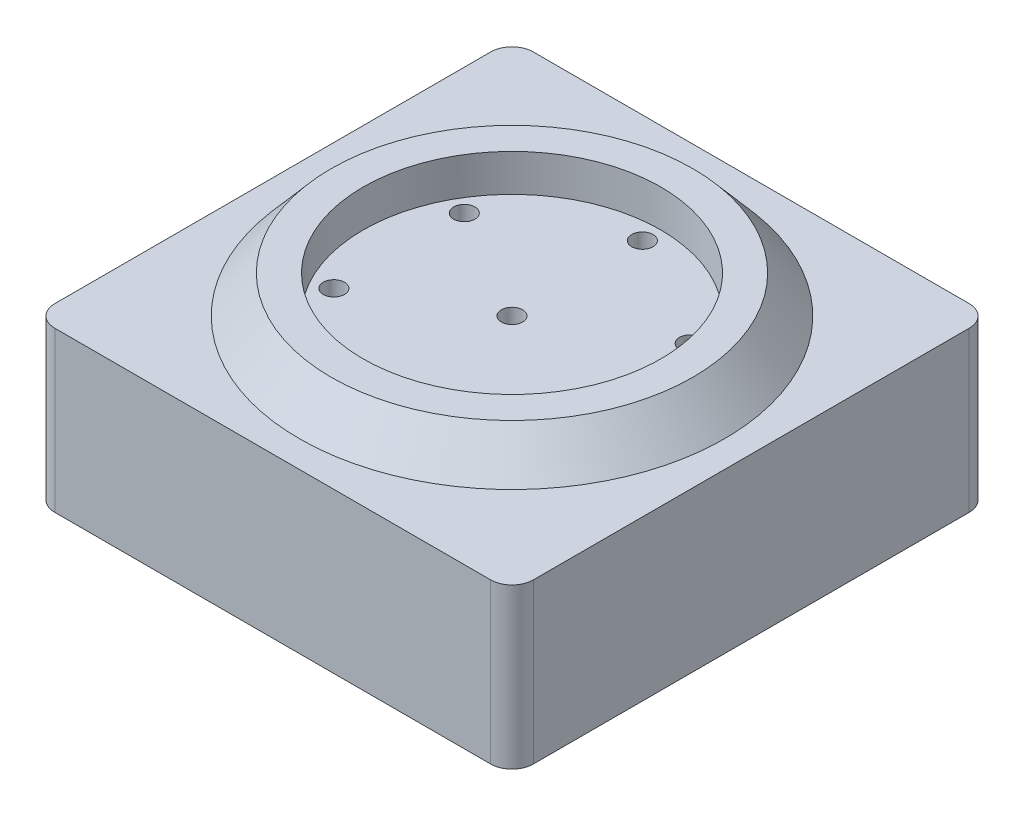
ISO-10303-21;
HEADER;
FILE_DESCRIPTION(('STEP AP214'),'2;1');
FILE_NAME('part.step','',(''),(''),'','','');
FILE_SCHEMA(('AUTOMOTIVE_DESIGN { 1 0 10303 214 1 1 1 1 }'));
ENDSEC;
DATA;
#1=APPLICATION_CONTEXT('core data for automotive mechanical design processes');
#2=APPLICATION_PROTOCOL_DEFINITION('international standard','automotive_design',2000,#1);
#3=PRODUCT_CONTEXT('',#1,'mechanical');
#4=PRODUCT('Part','Part','',(#3));
#5=PRODUCT_RELATED_PRODUCT_CATEGORY('part','',(#4));
#6=PRODUCT_DEFINITION_FORMATION('','',#4);
#7=PRODUCT_DEFINITION_CONTEXT('part definition',#1,'design');
#8=PRODUCT_DEFINITION('design','',#6,#7);
#9=PRODUCT_DEFINITION_SHAPE('','',#8);
#10=(LENGTH_UNIT() NAMED_UNIT(*) SI_UNIT(.MILLI.,.METRE.));
#11=(NAMED_UNIT(*) PLANE_ANGLE_UNIT() SI_UNIT($,.RADIAN.));
#12=(NAMED_UNIT(*) SI_UNIT($,.STERADIAN.) SOLID_ANGLE_UNIT());
#13=UNCERTAINTY_MEASURE_WITH_UNIT(LENGTH_MEASURE(1.E-05),#10,'distance_accuracy_value','');
#14=(GEOMETRIC_REPRESENTATION_CONTEXT(3) GLOBAL_UNCERTAINTY_ASSIGNED_CONTEXT((#13)) GLOBAL_UNIT_ASSIGNED_CONTEXT((#10,
#11,#12)) REPRESENTATION_CONTEXT('',''));
#15=CARTESIAN_POINT('',(0.,0.,0.));
#16=DIRECTION('',(0.,0.,1.));
#17=DIRECTION('',(1.,0.,0.));
#18=AXIS2_PLACEMENT_3D('',#15,#16,#17);
#19=CARTESIAN_POINT('',(-3.5527136788005E-12,-3.33066907387547E-12,0.));
#20=DIRECTION('',(0.,1.,0.));
#21=DIRECTION('',(-1.,0.,0.));
#22=AXIS2_PLACEMENT_3D('',#19,#20,#21);
#23=CYLINDRICAL_SURFACE('',#22,1400.);
#24=CARTESIAN_POINT('',(-8.88178419700125E-13,1850.,0.));
#25=DIRECTION('',(0.,1.,0.));
#26=DIRECTION('',(-1.,0.,0.));
#27=AXIS2_PLACEMENT_3D('',#24,#25,#26);
#28=CIRCLE('',#27,1400.);
#29=CARTESIAN_POINT('',(-1400.,1850.,0.));
#30=VERTEX_POINT('',#29);
#31=EDGE_CURVE('E227',#30,#30,#28,.T.);
#32=ORIENTED_EDGE('',*,*,#31,.T.);
#33=EDGE_LOOP('',(#32));
#34=FACE_BOUND('',#33,.T.);
#35=CARTESIAN_POINT('',(-1.33226762955019E-12,1500.,0.));
#36=DIRECTION('',(0.,-1.,0.));
#37=DIRECTION('',(0.,0.,-1.));
#38=AXIS2_PLACEMENT_3D('',#35,#36,#37);
#39=CIRCLE('',#38,1400.);
#40=CARTESIAN_POINT('',(-1.33226762955019E-12,1500.,-1400.));
#41=VERTEX_POINT('',#40);
#42=EDGE_CURVE('E13',#41,#41,#39,.F.);
#43=ORIENTED_EDGE('',*,*,#42,.F.);
#44=EDGE_LOOP('',(#43));
#45=FACE_BOUND('',#44,.T.);
#46=ADVANCED_FACE('F55',(#34,#45),#23,.F.);
#47=CARTESIAN_POINT('',(2050.,1500.,-2050.));
#48=DIRECTION('',(0.,-1.,0.));
#49=DIRECTION('',(0.,0.,-1.));
#50=AXIS2_PLACEMENT_3D('',#47,#48,#49);
#51=CYLINDRICAL_SURFACE('',#50,200.);
#52=CARTESIAN_POINT('',(2050.,0.,-2050.));
#53=DIRECTION('',(0.,1.,0.));
#54=DIRECTION('',(0.,0.,-1.));
#55=AXIS2_PLACEMENT_3D('',#52,#53,#54);
#56=CIRCLE('',#55,200.);
#57=CARTESIAN_POINT('',(2250.,0.,-2050.));
#58=VERTEX_POINT('',#57);
#59=CARTESIAN_POINT('',(2050.,0.,-2250.));
#60=VERTEX_POINT('',#59);
#61=EDGE_CURVE('E172',#58,#60,#56,.T.);
#62=ORIENTED_EDGE('',*,*,#61,.T.);
#63=DIRECTION('',(0.,-1.,0.));
#64=VECTOR('',#63,1.);
#65=CARTESIAN_POINT('',(2050.,1500.,-2250.));
#66=LINE('',#65,#64);
#67=CARTESIAN_POINT('',(2050.,1500.,-2250.));
#68=VERTEX_POINT('',#67);
#69=EDGE_CURVE('E215',#68,#60,#66,.T.);
#70=ORIENTED_EDGE('',*,*,#69,.F.);
#71=CARTESIAN_POINT('',(2050.,1500.,-2050.));
#72=DIRECTION('',(0.,1.,0.));
#73=DIRECTION('',(0.,0.,-1.));
#74=AXIS2_PLACEMENT_3D('',#71,#72,#73);
#75=CIRCLE('',#74,200.);
#76=CARTESIAN_POINT('',(2250.,1500.,-2050.));
#77=VERTEX_POINT('',#76);
#78=EDGE_CURVE('E196',#77,#68,#75,.T.);
#79=ORIENTED_EDGE('',*,*,#78,.F.);
#80=DIRECTION('',(0.,-1.,0.));
#81=VECTOR('',#80,1.);
#82=CARTESIAN_POINT('',(2250.,1500.,-2050.));
#83=LINE('',#82,#81);
#84=EDGE_CURVE('E168',#77,#58,#83,.T.);
#85=ORIENTED_EDGE('',*,*,#84,.T.);
#86=EDGE_LOOP('',(#62,#70,#79,#85));
#87=FACE_BOUND('',#86,.T.);
#88=ADVANCED_FACE('F57',(#87),#51,.T.);
#89=CARTESIAN_POINT('',(-2050.,1500.,-2250.));
#90=DIRECTION('',(0.,0.,1.));
#91=DIRECTION('',(1.,0.,0.));
#92=AXIS2_PLACEMENT_3D('',#89,#90,#91);
#93=PLANE('',#92);
#94=DIRECTION('',(-1.,0.,0.));
#95=VECTOR('',#94,1.);
#96=CARTESIAN_POINT('',(-2050.,0.,-2250.));
#97=LINE('',#96,#95);
#98=CARTESIAN_POINT('',(-2050.,0.,-2250.));
#99=VERTEX_POINT('',#98);
#100=EDGE_CURVE('E176',#60,#99,#97,.T.);
#101=ORIENTED_EDGE('',*,*,#100,.T.);
#102=DIRECTION('',(0.,-1.,0.));
#103=VECTOR('',#102,1.);
#104=CARTESIAN_POINT('',(-2050.,1500.,-2250.));
#105=LINE('',#104,#103);
#106=CARTESIAN_POINT('',(-2050.,1500.,-2250.));
#107=VERTEX_POINT('',#106);
#108=EDGE_CURVE('E211',#107,#99,#105,.T.);
#109=ORIENTED_EDGE('',*,*,#108,.F.);
#110=DIRECTION('',(-1.,0.,0.));
#111=VECTOR('',#110,1.);
#112=CARTESIAN_POINT('',(-2050.,1500.,-2250.));
#113=LINE('',#112,#111);
#114=EDGE_CURVE('E123',#68,#107,#113,.T.);
#115=ORIENTED_EDGE('',*,*,#114,.F.);
#116=ORIENTED_EDGE('',*,*,#69,.T.);
#117=EDGE_LOOP('',(#101,#109,#115,#116));
#118=FACE_BOUND('',#117,.T.);
#119=ADVANCED_FACE('F467',(#118),#93,.F.);
#120=CARTESIAN_POINT('',(-2050.,1500.,-2050.));
#121=DIRECTION('',(0.,-1.,0.));
#122=DIRECTION('',(0.,0.,-1.));
#123=AXIS2_PLACEMENT_3D('',#120,#121,#122);
#124=CYLINDRICAL_SURFACE('',#123,200.);
#125=CARTESIAN_POINT('',(-2050.,0.,-2050.));
#126=DIRECTION('',(0.,1.,0.));
#127=DIRECTION('',(0.,0.,1.));
#128=AXIS2_PLACEMENT_3D('',#125,#126,#127);
#129=CIRCLE('',#128,200.);
#130=CARTESIAN_POINT('',(-2250.,0.,-2050.));
#131=VERTEX_POINT('',#130);
#132=EDGE_CURVE('E180',#99,#131,#129,.T.);
#133=ORIENTED_EDGE('',*,*,#132,.T.);
#134=DIRECTION('',(0.,-1.,0.));
#135=VECTOR('',#134,1.);
#136=CARTESIAN_POINT('',(-2250.,1500.,-2050.));
#137=LINE('',#136,#135);
#138=CARTESIAN_POINT('',(-2250.,1500.,-2050.));
#139=VERTEX_POINT('',#138);
#140=EDGE_CURVE('E207',#139,#131,#137,.T.);
#141=ORIENTED_EDGE('',*,*,#140,.F.);
#142=CARTESIAN_POINT('',(-2050.,1500.,-2050.));
#143=DIRECTION('',(0.,1.,0.));
#144=DIRECTION('',(0.,0.,1.));
#145=AXIS2_PLACEMENT_3D('',#142,#143,#144);
#146=CIRCLE('',#145,200.);
#147=EDGE_CURVE('E236',#107,#139,#146,.T.);
#148=ORIENTED_EDGE('',*,*,#147,.F.);
#149=ORIENTED_EDGE('',*,*,#108,.T.);
#150=EDGE_LOOP('',(#133,#141,#148,#149));
#151=FACE_BOUND('',#150,.T.);
#152=ADVANCED_FACE('F746',(#151),#124,.T.);
#153=CARTESIAN_POINT('',(-2250.,1500.,-2050.));
#154=DIRECTION('',(1.,0.,0.));
#155=DIRECTION('',(0.,0.,-1.));
#156=AXIS2_PLACEMENT_3D('',#153,#154,#155);
#157=PLANE('',#156);
#158=DIRECTION('',(0.,0.,1.));
#159=VECTOR('',#158,1.);
#160=CARTESIAN_POINT('',(-2250.,0.,-2050.));
#161=LINE('',#160,#159);
#162=CARTESIAN_POINT('',(-2250.,0.,2050.));
#163=VERTEX_POINT('',#162);
#164=EDGE_CURVE('E183',#131,#163,#161,.T.);
#165=ORIENTED_EDGE('',*,*,#164,.T.);
#166=DIRECTION('',(0.,-1.,0.));
#167=VECTOR('',#166,1.);
#168=CARTESIAN_POINT('',(-2250.,1500.,2050.));
#169=LINE('',#168,#167);
#170=CARTESIAN_POINT('',(-2250.,1500.,2050.));
#171=VERTEX_POINT('',#170);
#172=EDGE_CURVE('E203',#171,#163,#169,.T.);
#173=ORIENTED_EDGE('',*,*,#172,.F.);
#174=DIRECTION('',(0.,0.,1.));
#175=VECTOR('',#174,1.);
#176=CARTESIAN_POINT('',(-2250.,1500.,-2050.));
#177=LINE('',#176,#175);
#178=EDGE_CURVE('E239',#139,#171,#177,.T.);
#179=ORIENTED_EDGE('',*,*,#178,.F.);
#180=ORIENTED_EDGE('',*,*,#140,.T.);
#181=EDGE_LOOP('',(#165,#173,#179,#180));
#182=FACE_BOUND('',#181,.T.);
#183=ADVANCED_FACE('F738',(#182),#157,.F.);
#184=CARTESIAN_POINT('',(-2050.,1500.,2050.));
#185=DIRECTION('',(0.,-1.,0.));
#186=DIRECTION('',(0.,0.,-1.));
#187=AXIS2_PLACEMENT_3D('',#184,#185,#186);
#188=CYLINDRICAL_SURFACE('',#187,200.);
#189=CARTESIAN_POINT('',(-2050.,0.,2050.));
#190=DIRECTION('',(0.,1.,0.));
#191=DIRECTION('',(0.,0.,1.));
#192=AXIS2_PLACEMENT_3D('',#189,#190,#191);
#193=CIRCLE('',#192,200.);
#194=CARTESIAN_POINT('',(-2050.,0.,2250.));
#195=VERTEX_POINT('',#194);
#196=EDGE_CURVE('E186',#163,#195,#193,.T.);
#197=ORIENTED_EDGE('',*,*,#196,.T.);
#198=DIRECTION('',(0.,-1.,0.));
#199=VECTOR('',#198,1.);
#200=CARTESIAN_POINT('',(-2050.,1500.,2250.));
#201=LINE('',#200,#199);
#202=CARTESIAN_POINT('',(-2050.,1500.,2250.));
#203=VERTEX_POINT('',#202);
#204=EDGE_CURVE('E160',#203,#195,#201,.T.);
#205=ORIENTED_EDGE('',*,*,#204,.F.);
#206=CARTESIAN_POINT('',(-2050.,1500.,2050.));
#207=DIRECTION('',(0.,1.,0.));
#208=DIRECTION('',(0.,0.,1.));
#209=AXIS2_PLACEMENT_3D('',#206,#207,#208);
#210=CIRCLE('',#209,200.);
#211=EDGE_CURVE('E146',#171,#203,#210,.T.);
#212=ORIENTED_EDGE('',*,*,#211,.F.);
#213=ORIENTED_EDGE('',*,*,#172,.T.);
#214=EDGE_LOOP('',(#197,#205,#212,#213));
#215=FACE_BOUND('',#214,.T.);
#216=ADVANCED_FACE('F731',(#215),#188,.T.);
#217=CARTESIAN_POINT('',(-2050.,1500.,2250.));
#218=DIRECTION('',(0.,0.,-1.));
#219=DIRECTION('',(-1.,0.,0.));
#220=AXIS2_PLACEMENT_3D('',#217,#218,#219);
#221=PLANE('',#220);
#222=DIRECTION('',(1.,0.,0.));
#223=VECTOR('',#222,1.);
#224=CARTESIAN_POINT('',(-2050.,0.,2250.));
#225=LINE('',#224,#223);
#226=CARTESIAN_POINT('',(2050.,0.,2250.));
#227=VERTEX_POINT('',#226);
#228=EDGE_CURVE('E156',#195,#227,#225,.T.);
#229=ORIENTED_EDGE('',*,*,#228,.T.);
#230=DIRECTION('',(0.,-1.,0.));
#231=VECTOR('',#230,1.);
#232=CARTESIAN_POINT('',(2050.,1500.,2250.));
#233=LINE('',#232,#231);
#234=CARTESIAN_POINT('',(2050.,1500.,2250.));
#235=VERTEX_POINT('',#234);
#236=EDGE_CURVE('E153',#235,#227,#233,.T.);
#237=ORIENTED_EDGE('',*,*,#236,.F.);
#238=DIRECTION('',(1.,0.,0.));
#239=VECTOR('',#238,1.);
#240=CARTESIAN_POINT('',(-2050.,1500.,2250.));
#241=LINE('',#240,#239);
#242=EDGE_CURVE('E139',#203,#235,#241,.T.);
#243=ORIENTED_EDGE('',*,*,#242,.F.);
#244=ORIENTED_EDGE('',*,*,#204,.T.);
#245=EDGE_LOOP('',(#229,#237,#243,#244));
#246=FACE_BOUND('',#245,.T.);
#247=ADVANCED_FACE('F154',(#246),#221,.F.);
#248=CARTESIAN_POINT('',(2050.,1500.,2050.));
#249=DIRECTION('',(0.,-1.,0.));
#250=DIRECTION('',(0.,0.,-1.));
#251=AXIS2_PLACEMENT_3D('',#248,#249,#250);
#252=CYLINDRICAL_SURFACE('',#251,200.);
#253=CARTESIAN_POINT('',(2050.,0.,2050.));
#254=DIRECTION('',(0.,1.,0.));
#255=DIRECTION('',(0.,0.,1.));
#256=AXIS2_PLACEMENT_3D('',#253,#254,#255);
#257=CIRCLE('',#256,200.);
#258=CARTESIAN_POINT('',(2250.,0.,2050.));
#259=VERTEX_POINT('',#258);
#260=EDGE_CURVE('E191',#227,#259,#257,.T.);
#261=ORIENTED_EDGE('',*,*,#260,.T.);
#262=DIRECTION('',(0.,-1.,0.));
#263=VECTOR('',#262,1.);
#264=CARTESIAN_POINT('',(2250.,1500.,2050.));
#265=LINE('',#264,#263);
#266=CARTESIAN_POINT('',(2250.,1500.,2050.));
#267=VERTEX_POINT('',#266);
#268=EDGE_CURVE('E161',#267,#259,#265,.T.);
#269=ORIENTED_EDGE('',*,*,#268,.F.);
#270=CARTESIAN_POINT('',(2050.,1500.,2050.));
#271=DIRECTION('',(0.,1.,0.));
#272=DIRECTION('',(0.,0.,1.));
#273=AXIS2_PLACEMENT_3D('',#270,#271,#272);
#274=CIRCLE('',#273,200.);
#275=EDGE_CURVE('E143',#235,#267,#274,.T.);
#276=ORIENTED_EDGE('',*,*,#275,.F.);
#277=ORIENTED_EDGE('',*,*,#236,.T.);
#278=EDGE_LOOP('',(#261,#269,#276,#277));
#279=FACE_BOUND('',#278,.T.);
#280=ADVANCED_FACE('F163',(#279),#252,.T.);
#281=CARTESIAN_POINT('',(2250.,1500.,-2050.));
#282=DIRECTION('',(-1.,0.,0.));
#283=DIRECTION('',(0.,0.,1.));
#284=AXIS2_PLACEMENT_3D('',#281,#282,#283);
#285=PLANE('',#284);
#286=DIRECTION('',(0.,0.,-1.));
#287=VECTOR('',#286,1.);
#288=CARTESIAN_POINT('',(2250.,0.,-2050.));
#289=LINE('',#288,#287);
#290=EDGE_CURVE('E114',#259,#58,#289,.T.);
#291=ORIENTED_EDGE('',*,*,#290,.T.);
#292=ORIENTED_EDGE('',*,*,#84,.F.);
#293=DIRECTION('',(0.,0.,-1.));
#294=VECTOR('',#293,1.);
#295=CARTESIAN_POINT('',(2250.,1500.,-2050.));
#296=LINE('',#295,#294);
#297=EDGE_CURVE('E81',#267,#77,#296,.T.);
#298=ORIENTED_EDGE('',*,*,#297,.F.);
#299=ORIENTED_EDGE('',*,*,#268,.T.);
#300=EDGE_LOOP('',(#291,#292,#298,#299));
#301=FACE_BOUND('',#300,.T.);
#302=ADVANCED_FACE('F448',(#301),#285,.F.);
#303=CARTESIAN_POINT('',(2050.,1500.,-2050.));
#304=DIRECTION('',(0.,-1.,0.));
#305=DIRECTION('',(0.,0.,-1.));
#306=AXIS2_PLACEMENT_3D('',#303,#304,#305);
#307=PLANE('',#306);
#308=CARTESIAN_POINT('',(0.,1500.,0.));
#309=DIRECTION('',(0.,1.,0.));
#310=DIRECTION('',(-1.,0.,0.));
#311=AXIS2_PLACEMENT_3D('',#308,#309,#310);
#312=CIRCLE('',#311,2000.);
#313=CARTESIAN_POINT('',(-2000.,1500.,0.));
#314=VERTEX_POINT('',#313);
#315=EDGE_CURVE('E65',#314,#314,#312,.T.);
#316=ORIENTED_EDGE('',*,*,#315,.F.);
#317=EDGE_LOOP('',(#316));
#318=FACE_BOUND('',#317,.T.);
#319=ORIENTED_EDGE('',*,*,#78,.T.);
#320=ORIENTED_EDGE('',*,*,#114,.T.);
#321=ORIENTED_EDGE('',*,*,#147,.T.);
#322=ORIENTED_EDGE('',*,*,#178,.T.);
#323=ORIENTED_EDGE('',*,*,#211,.T.);
#324=ORIENTED_EDGE('',*,*,#242,.T.);
#325=ORIENTED_EDGE('',*,*,#275,.T.);
#326=ORIENTED_EDGE('',*,*,#297,.T.);
#327=EDGE_LOOP('',(#319,#320,#321,#322,#323,#324,#325,#326));
#328=FACE_BOUND('',#327,.T.);
#329=ADVANCED_FACE('F141',(#318,#328),#307,.F.);
#330=CARTESIAN_POINT('',(2050.,0.,-2050.));
#331=DIRECTION('',(0.,-1.,0.));
#332=DIRECTION('',(0.,0.,-1.));
#333=AXIS2_PLACEMENT_3D('',#330,#331,#332);
#334=PLANE('',#333);
#335=CARTESIAN_POINT('',(-2050.,0.,-2050.));
#336=DIRECTION('',(0.,-1.,0.));
#337=DIRECTION('',(0.,0.,1.));
#338=AXIS2_PLACEMENT_3D('',#335,#336,#337);
#339=CIRCLE('',#338,100.);
#340=CARTESIAN_POINT('',(-2050.,0.,-1950.));
#341=VERTEX_POINT('',#340);
#342=EDGE_CURVE('E393',#341,#341,#339,.T.);
#343=ORIENTED_EDGE('',*,*,#342,.F.);
#344=EDGE_LOOP('',(#343));
#345=FACE_BOUND('',#344,.T.);
#346=CARTESIAN_POINT('',(2050.,0.,-2050.));
#347=DIRECTION('',(0.,-1.,0.));
#348=DIRECTION('',(0.,0.,-1.));
#349=AXIS2_PLACEMENT_3D('',#346,#347,#348);
#350=CIRCLE('',#349,100.);
#351=CARTESIAN_POINT('',(2050.,0.,-2150.));
#352=VERTEX_POINT('',#351);
#353=EDGE_CURVE('E403',#352,#352,#350,.T.);
#354=ORIENTED_EDGE('',*,*,#353,.F.);
#355=EDGE_LOOP('',(#354));
#356=FACE_BOUND('',#355,.T.);
#357=CARTESIAN_POINT('',(2050.,0.,2050.));
#358=DIRECTION('',(0.,-1.,0.));
#359=DIRECTION('',(0.,0.,1.));
#360=AXIS2_PLACEMENT_3D('',#357,#358,#359);
#361=CIRCLE('',#360,100.);
#362=CARTESIAN_POINT('',(2050.,0.,2150.));
#363=VERTEX_POINT('',#362);
#364=EDGE_CURVE('E413',#363,#363,#361,.T.);
#365=ORIENTED_EDGE('',*,*,#364,.F.);
#366=EDGE_LOOP('',(#365));
#367=FACE_BOUND('',#366,.T.);
#368=CARTESIAN_POINT('',(-2050.,0.,2050.));
#369=DIRECTION('',(0.,-1.,0.));
#370=DIRECTION('',(0.,0.,-1.));
#371=AXIS2_PLACEMENT_3D('',#368,#369,#370);
#372=CIRCLE('',#371,100.);
#373=CARTESIAN_POINT('',(-2050.,0.,1950.));
#374=VERTEX_POINT('',#373);
#375=EDGE_CURVE('E388',#374,#374,#372,.T.);
#376=ORIENTED_EDGE('',*,*,#375,.F.);
#377=EDGE_LOOP('',(#376));
#378=FACE_BOUND('',#377,.T.);
#379=DIRECTION('',(1.,0.,0.));
#380=VECTOR('',#379,1.);
#381=CARTESIAN_POINT('',(-1750.,0.,-1750.));
#382=LINE('',#381,#380);
#383=CARTESIAN_POINT('',(-1750.,0.,-1750.));
#384=VERTEX_POINT('',#383);
#385=CARTESIAN_POINT('',(1750.,0.,-1750.));
#386=VERTEX_POINT('',#385);
#387=EDGE_CURVE('E72',#384,#386,#382,.T.);
#388=ORIENTED_EDGE('',*,*,#387,.F.);
#389=DIRECTION('',(0.,0.,-1.));
#390=VECTOR('',#389,1.);
#391=CARTESIAN_POINT('',(-1750.,0.,1750.));
#392=LINE('',#391,#390);
#393=CARTESIAN_POINT('',(-1750.,0.,1750.));
#394=VERTEX_POINT('',#393);
#395=EDGE_CURVE('E365',#394,#384,#392,.T.);
#396=ORIENTED_EDGE('',*,*,#395,.F.);
#397=DIRECTION('',(1.,0.,0.));
#398=VECTOR('',#397,1.);
#399=CARTESIAN_POINT('',(-1750.,0.,1750.));
#400=LINE('',#399,#398);
#401=CARTESIAN_POINT('',(1750.,0.,1750.));
#402=VERTEX_POINT('',#401);
#403=EDGE_CURVE('E370',#394,#402,#400,.T.);
#404=ORIENTED_EDGE('',*,*,#403,.T.);
#405=DIRECTION('',(0.,0.,-1.));
#406=VECTOR('',#405,1.);
#407=CARTESIAN_POINT('',(1750.,0.,1750.));
#408=LINE('',#407,#406);
#409=EDGE_CURVE('E375',#402,#386,#408,.T.);
#410=ORIENTED_EDGE('',*,*,#409,.T.);
#411=EDGE_LOOP('',(#388,#396,#404,#410));
#412=FACE_BOUND('',#411,.T.);
#413=ORIENTED_EDGE('',*,*,#61,.F.);
#414=ORIENTED_EDGE('',*,*,#290,.F.);
#415=ORIENTED_EDGE('',*,*,#260,.F.);
#416=ORIENTED_EDGE('',*,*,#228,.F.);
#417=ORIENTED_EDGE('',*,*,#196,.F.);
#418=ORIENTED_EDGE('',*,*,#164,.F.);
#419=ORIENTED_EDGE('',*,*,#132,.F.);
#420=ORIENTED_EDGE('',*,*,#100,.F.);
#421=EDGE_LOOP('',(#413,#414,#415,#416,#417,#418,#419,#420));
#422=FACE_BOUND('',#421,.T.);
#423=ADVANCED_FACE('F434',(#345,#356,#367,#378,#412,#422),#334,.T.);
#424=CARTESIAN_POINT('',(0.,1850.,0.));
#425=DIRECTION('',(0.,-1.,0.));
#426=DIRECTION('',(1.,0.,0.));
#427=AXIS2_PLACEMENT_3D('',#424,#425,#426);
#428=PLANE('',#427);
#429=ORIENTED_EDGE('',*,*,#31,.F.);
#430=EDGE_LOOP('',(#429));
#431=FACE_BOUND('',#430,.T.);
#432=CARTESIAN_POINT('',(0.,1850.,0.));
#433=DIRECTION('',(0.,1.,0.));
#434=DIRECTION('',(-1.,0.,0.));
#435=AXIS2_PLACEMENT_3D('',#432,#433,#434);
#436=CIRCLE('',#435,1700.);
#437=CARTESIAN_POINT('',(-1700.,1850.,0.));
#438=VERTEX_POINT('',#437);
#439=EDGE_CURVE('E177',#438,#438,#436,.T.);
#440=ORIENTED_EDGE('',*,*,#439,.T.);
#441=EDGE_LOOP('',(#440));
#442=FACE_BOUND('',#441,.T.);
#443=ADVANCED_FACE('F437',(#431,#442),#428,.F.);
#444=CARTESIAN_POINT('',(0.,1500.,0.));
#445=DIRECTION('',(0.,-1.,0.));
#446=DIRECTION('',(1.,0.,0.));
#447=AXIS2_PLACEMENT_3D('',#444,#445,#446);
#448=CONICAL_SURFACE('',#447,2000.,0.70862627212767);
#449=ORIENTED_EDGE('',*,*,#439,.F.);
#450=EDGE_LOOP('',(#449));
#451=FACE_BOUND('',#450,.T.);
#452=ORIENTED_EDGE('',*,*,#315,.T.);
#453=EDGE_LOOP('',(#452));
#454=FACE_BOUND('',#453,.T.);
#455=ADVANCED_FACE('F473',(#451,#454),#448,.T.);
#456=CARTESIAN_POINT('',(2050.,1500.,-2050.));
#457=DIRECTION('',(0.,-1.,0.));
#458=DIRECTION('',(0.,0.,-1.));
#459=AXIS2_PLACEMENT_3D('',#456,#457,#458);
#460=PLANE('',#459);
#461=CARTESIAN_POINT('',(0.,1500.,0.));
#462=DIRECTION('',(0.,1.,0.));
#463=DIRECTION('',(0.,0.,1.));
#464=AXIS2_PLACEMENT_3D('',#461,#462,#463);
#465=CIRCLE('',#464,100.);
#466=CARTESIAN_POINT('',(0.,1500.,100.));
#467=VERTEX_POINT('',#466);
#468=EDGE_CURVE('E290',#467,#467,#465,.T.);
#469=ORIENTED_EDGE('',*,*,#468,.F.);
#470=EDGE_LOOP('',(#469));
#471=FACE_BOUND('',#470,.T.);
#472=CARTESIAN_POINT('',(0.,1500.,-1226.25));
#473=DIRECTION('',(0.,1.,0.));
#474=DIRECTION('',(0.,0.,1.));
#475=AXIS2_PLACEMENT_3D('',#472,#473,#474);
#476=CIRCLE('',#475,100.);
#477=CARTESIAN_POINT('',(0.,1500.,-1126.25));
#478=VERTEX_POINT('',#477);
#479=EDGE_CURVE('E261',#478,#478,#476,.T.);
#480=ORIENTED_EDGE('',*,*,#479,.F.);
#481=EDGE_LOOP('',(#480));
#482=FACE_BOUND('',#481,.T.);
#483=CARTESIAN_POINT('',(-1061.96365139067,1500.,-613.124999999999));
#484=DIRECTION('',(0.,1.,0.));
#485=DIRECTION('',(0.,0.,1.));
#486=AXIS2_PLACEMENT_3D('',#483,#484,#485);
#487=CIRCLE('',#486,100.);
#488=CARTESIAN_POINT('',(-1061.96365139067,1500.,-513.124999999999));
#489=VERTEX_POINT('',#488);
#490=EDGE_CURVE('E285',#489,#489,#487,.T.);
#491=ORIENTED_EDGE('',*,*,#490,.F.);
#492=EDGE_LOOP('',(#491));
#493=FACE_BOUND('',#492,.T.);
#494=CARTESIAN_POINT('',(-1061.96365139067,1500.,613.125000000001));
#495=DIRECTION('',(0.,1.,0.));
#496=DIRECTION('',(0.,0.,1.));
#497=AXIS2_PLACEMENT_3D('',#494,#495,#496);
#498=CIRCLE('',#497,100.);
#499=CARTESIAN_POINT('',(-1061.96365139067,1500.,713.125000000001));
#500=VERTEX_POINT('',#499);
#501=EDGE_CURVE('E280',#500,#500,#498,.T.);
#502=ORIENTED_EDGE('',*,*,#501,.F.);
#503=EDGE_LOOP('',(#502));
#504=FACE_BOUND('',#503,.T.);
#505=CARTESIAN_POINT('',(4.44089209850063E-13,1500.,1226.25));
#506=DIRECTION('',(0.,1.,0.));
#507=DIRECTION('',(0.,0.,1.));
#508=AXIS2_PLACEMENT_3D('',#505,#506,#507);
#509=CIRCLE('',#508,100.);
#510=CARTESIAN_POINT('',(4.44089209850063E-13,1500.,1326.25));
#511=VERTEX_POINT('',#510);
#512=EDGE_CURVE('E275',#511,#511,#509,.T.);
#513=ORIENTED_EDGE('',*,*,#512,.F.);
#514=EDGE_LOOP('',(#513));
#515=FACE_BOUND('',#514,.T.);
#516=CARTESIAN_POINT('',(1061.96365139067,1500.,613.125));
#517=DIRECTION('',(0.,1.,0.));
#518=DIRECTION('',(0.,0.,1.));
#519=AXIS2_PLACEMENT_3D('',#516,#517,#518);
#520=CIRCLE('',#519,100.);
#521=CARTESIAN_POINT('',(1061.96365139067,1500.,713.125));
#522=VERTEX_POINT('',#521);
#523=EDGE_CURVE('E270',#522,#522,#520,.T.);
#524=ORIENTED_EDGE('',*,*,#523,.F.);
#525=EDGE_LOOP('',(#524));
#526=FACE_BOUND('',#525,.T.);
#527=CARTESIAN_POINT('',(1061.96365139067,1500.,-613.125000000001));
#528=DIRECTION('',(0.,1.,0.));
#529=DIRECTION('',(0.,0.,1.));
#530=AXIS2_PLACEMENT_3D('',#527,#528,#529);
#531=CIRCLE('',#530,100.);
#532=CARTESIAN_POINT('',(1061.96365139067,1500.,-513.125));
#533=VERTEX_POINT('',#532);
#534=EDGE_CURVE('E265',#533,#533,#531,.T.);
#535=ORIENTED_EDGE('',*,*,#534,.F.);
#536=EDGE_LOOP('',(#535));
#537=FACE_BOUND('',#536,.T.);
#538=ORIENTED_EDGE('',*,*,#42,.T.);
#539=EDGE_LOOP('',(#538));
#540=FACE_BOUND('',#539,.T.);
#541=ADVANCED_FACE('F471',(#471,#482,#493,#504,#515,#526,#537,#540),#460,.F.);
#542=CARTESIAN_POINT('',(1061.96365139067,1000.,-613.125000000001));
#543=DIRECTION('',(0.,1.,0.));
#544=DIRECTION('',(0.,0.,1.));
#545=AXIS2_PLACEMENT_3D('',#542,#543,#544);
#546=CYLINDRICAL_SURFACE('',#545,100.);
#547=CARTESIAN_POINT('',(1061.96365139067,1000.,-613.125000000001));
#548=DIRECTION('',(0.,1.,0.));
#549=DIRECTION('',(0.,0.,1.));
#550=AXIS2_PLACEMENT_3D('',#547,#548,#549);
#551=CIRCLE('',#550,100.);
#552=CARTESIAN_POINT('',(1061.96365139067,1000.,-513.125));
#553=VERTEX_POINT('',#552);
#554=EDGE_CURVE('E295',#553,#553,#551,.T.);
#555=ORIENTED_EDGE('',*,*,#554,.F.);
#556=EDGE_LOOP('',(#555));
#557=FACE_BOUND('',#556,.T.);
#558=ORIENTED_EDGE('',*,*,#534,.T.);
#559=EDGE_LOOP('',(#558));
#560=FACE_BOUND('',#559,.T.);
#561=ADVANCED_FACE('F501',(#557,#560),#546,.F.);
#562=CARTESIAN_POINT('',(1061.96365139067,1000.,613.125));
#563=DIRECTION('',(0.,1.,0.));
#564=DIRECTION('',(0.,0.,1.));
#565=AXIS2_PLACEMENT_3D('',#562,#563,#564);
#566=CYLINDRICAL_SURFACE('',#565,100.);
#567=CARTESIAN_POINT('',(1061.96365139067,1000.,613.125));
#568=DIRECTION('',(0.,1.,0.));
#569=DIRECTION('',(0.,0.,1.));
#570=AXIS2_PLACEMENT_3D('',#567,#568,#569);
#571=CIRCLE('',#570,100.);
#572=CARTESIAN_POINT('',(1061.96365139067,1000.,713.125));
#573=VERTEX_POINT('',#572);
#574=EDGE_CURVE('E300',#573,#573,#571,.T.);
#575=ORIENTED_EDGE('',*,*,#574,.F.);
#576=EDGE_LOOP('',(#575));
#577=FACE_BOUND('',#576,.T.);
#578=ORIENTED_EDGE('',*,*,#523,.T.);
#579=EDGE_LOOP('',(#578));
#580=FACE_BOUND('',#579,.T.);
#581=ADVANCED_FACE('F508',(#577,#580),#566,.F.);
#582=CARTESIAN_POINT('',(4.44089209850063E-13,1000.,1226.25));
#583=DIRECTION('',(0.,1.,0.));
#584=DIRECTION('',(0.,0.,1.));
#585=AXIS2_PLACEMENT_3D('',#582,#583,#584);
#586=CYLINDRICAL_SURFACE('',#585,100.);
#587=CARTESIAN_POINT('',(4.44089209850063E-13,1000.,1226.25));
#588=DIRECTION('',(0.,1.,0.));
#589=DIRECTION('',(0.,0.,1.));
#590=AXIS2_PLACEMENT_3D('',#587,#588,#589);
#591=CIRCLE('',#590,100.);
#592=CARTESIAN_POINT('',(4.44089209850063E-13,1000.,1326.25));
#593=VERTEX_POINT('',#592);
#594=EDGE_CURVE('E305',#593,#593,#591,.T.);
#595=ORIENTED_EDGE('',*,*,#594,.F.);
#596=EDGE_LOOP('',(#595));
#597=FACE_BOUND('',#596,.T.);
#598=ORIENTED_EDGE('',*,*,#512,.T.);
#599=EDGE_LOOP('',(#598));
#600=FACE_BOUND('',#599,.T.);
#601=ADVANCED_FACE('F516',(#597,#600),#586,.F.);
#602=CARTESIAN_POINT('',(-1061.96365139067,1000.,613.125000000001));
#603=DIRECTION('',(0.,1.,0.));
#604=DIRECTION('',(0.,0.,1.));
#605=AXIS2_PLACEMENT_3D('',#602,#603,#604);
#606=CYLINDRICAL_SURFACE('',#605,100.);
#607=CARTESIAN_POINT('',(-1061.96365139067,1000.,613.125000000001));
#608=DIRECTION('',(0.,1.,0.));
#609=DIRECTION('',(0.,0.,1.));
#610=AXIS2_PLACEMENT_3D('',#607,#608,#609);
#611=CIRCLE('',#610,100.);
#612=CARTESIAN_POINT('',(-1061.96365139067,1000.,713.125000000001));
#613=VERTEX_POINT('',#612);
#614=EDGE_CURVE('E310',#613,#613,#611,.T.);
#615=ORIENTED_EDGE('',*,*,#614,.F.);
#616=EDGE_LOOP('',(#615));
#617=FACE_BOUND('',#616,.T.);
#618=ORIENTED_EDGE('',*,*,#501,.T.);
#619=EDGE_LOOP('',(#618));
#620=FACE_BOUND('',#619,.T.);
#621=ADVANCED_FACE('F524',(#617,#620),#606,.F.);
#622=CARTESIAN_POINT('',(-1061.96365139067,1000.,-613.124999999999));
#623=DIRECTION('',(0.,1.,0.));
#624=DIRECTION('',(0.,0.,1.));
#625=AXIS2_PLACEMENT_3D('',#622,#623,#624);
#626=CYLINDRICAL_SURFACE('',#625,100.);
#627=CARTESIAN_POINT('',(-1061.96365139067,1000.,-613.124999999999));
#628=DIRECTION('',(0.,1.,0.));
#629=DIRECTION('',(0.,0.,1.));
#630=AXIS2_PLACEMENT_3D('',#627,#628,#629);
#631=CIRCLE('',#630,100.);
#632=CARTESIAN_POINT('',(-1061.96365139067,1000.,-513.124999999999));
#633=VERTEX_POINT('',#632);
#634=EDGE_CURVE('E315',#633,#633,#631,.T.);
#635=ORIENTED_EDGE('',*,*,#634,.F.);
#636=EDGE_LOOP('',(#635));
#637=FACE_BOUND('',#636,.T.);
#638=ORIENTED_EDGE('',*,*,#490,.T.);
#639=EDGE_LOOP('',(#638));
#640=FACE_BOUND('',#639,.T.);
#641=ADVANCED_FACE('F532',(#637,#640),#626,.F.);
#642=CARTESIAN_POINT('',(0.,1000.,-1226.25));
#643=DIRECTION('',(0.,1.,0.));
#644=DIRECTION('',(0.,0.,1.));
#645=AXIS2_PLACEMENT_3D('',#642,#643,#644);
#646=CYLINDRICAL_SURFACE('',#645,100.);
#647=CARTESIAN_POINT('',(0.,1000.,-1226.25));
#648=DIRECTION('',(0.,1.,0.));
#649=DIRECTION('',(0.,0.,1.));
#650=AXIS2_PLACEMENT_3D('',#647,#648,#649);
#651=CIRCLE('',#650,100.);
#652=CARTESIAN_POINT('',(0.,1000.,-1126.25));
#653=VERTEX_POINT('',#652);
#654=EDGE_CURVE('E319',#653,#653,#651,.T.);
#655=ORIENTED_EDGE('',*,*,#654,.F.);
#656=EDGE_LOOP('',(#655));
#657=FACE_BOUND('',#656,.T.);
#658=ORIENTED_EDGE('',*,*,#479,.T.);
#659=EDGE_LOOP('',(#658));
#660=FACE_BOUND('',#659,.T.);
#661=ADVANCED_FACE('F539',(#657,#660),#646,.F.);
#662=CARTESIAN_POINT('',(0.,500.,0.));
#663=DIRECTION('',(0.,1.,0.));
#664=DIRECTION('',(0.,0.,1.));
#665=AXIS2_PLACEMENT_3D('',#662,#663,#664);
#666=CYLINDRICAL_SURFACE('',#665,100.);
#667=CARTESIAN_POINT('',(0.,1000.,0.));
#668=DIRECTION('',(0.,1.,0.));
#669=DIRECTION('',(0.,0.,1.));
#670=AXIS2_PLACEMENT_3D('',#667,#668,#669);
#671=CIRCLE('',#670,100.);
#672=CARTESIAN_POINT('',(0.,1000.,100.));
#673=VERTEX_POINT('',#672);
#674=EDGE_CURVE('E59',#673,#673,#671,.F.);
#675=ORIENTED_EDGE('',*,*,#674,.T.);
#676=EDGE_LOOP('',(#675));
#677=FACE_BOUND('',#676,.T.);
#678=ORIENTED_EDGE('',*,*,#468,.T.);
#679=EDGE_LOOP('',(#678));
#680=FACE_BOUND('',#679,.T.);
#681=ADVANCED_FACE('F547',(#677,#680),#666,.F.);
#682=CARTESIAN_POINT('',(0.,1000.,0.));
#683=DIRECTION('',(0.,1.,0.));
#684=DIRECTION('',(0.,0.,1.));
#685=AXIS2_PLACEMENT_3D('',#682,#683,#684);
#686=PLANE('',#685);
#687=ORIENTED_EDGE('',*,*,#554,.T.);
#688=EDGE_LOOP('',(#687));
#689=FACE_BOUND('',#688,.T.);
#690=ORIENTED_EDGE('',*,*,#574,.T.);
#691=EDGE_LOOP('',(#690));
#692=FACE_BOUND('',#691,.T.);
#693=ORIENTED_EDGE('',*,*,#594,.T.);
#694=EDGE_LOOP('',(#693));
#695=FACE_BOUND('',#694,.T.);
#696=ORIENTED_EDGE('',*,*,#614,.T.);
#697=EDGE_LOOP('',(#696));
#698=FACE_BOUND('',#697,.T.);
#699=ORIENTED_EDGE('',*,*,#634,.T.);
#700=EDGE_LOOP('',(#699));
#701=FACE_BOUND('',#700,.T.);
#702=ORIENTED_EDGE('',*,*,#654,.T.);
#703=EDGE_LOOP('',(#702));
#704=FACE_BOUND('',#703,.T.);
#705=DIRECTION('',(1.,0.,0.));
#706=VECTOR('',#705,1.);
#707=CARTESIAN_POINT('',(-1750.,1000.,-1750.));
#708=LINE('',#707,#706);
#709=CARTESIAN_POINT('',(-1750.,1000.,-1750.));
#710=VERTEX_POINT('',#709);
#711=CARTESIAN_POINT('',(1750.,1000.,-1750.));
#712=VERTEX_POINT('',#711);
#713=EDGE_CURVE('E360',#710,#712,#708,.T.);
#714=ORIENTED_EDGE('',*,*,#713,.T.);
#715=DIRECTION('',(0.,0.,-1.));
#716=VECTOR('',#715,1.);
#717=CARTESIAN_POINT('',(1750.,1000.,1750.));
#718=LINE('',#717,#716);
#719=CARTESIAN_POINT('',(1750.,1000.,1750.));
#720=VERTEX_POINT('',#719);
#721=EDGE_CURVE('E355',#720,#712,#718,.T.);
#722=ORIENTED_EDGE('',*,*,#721,.F.);
#723=DIRECTION('',(1.,0.,0.));
#724=VECTOR('',#723,1.);
#725=CARTESIAN_POINT('',(-1750.,1000.,1750.));
#726=LINE('',#725,#724);
#727=CARTESIAN_POINT('',(-1750.,1000.,1750.));
#728=VERTEX_POINT('',#727);
#729=EDGE_CURVE('E350',#728,#720,#726,.T.);
#730=ORIENTED_EDGE('',*,*,#729,.F.);
#731=DIRECTION('',(0.,0.,-1.));
#732=VECTOR('',#731,1.);
#733=CARTESIAN_POINT('',(-1750.,1000.,1750.));
#734=LINE('',#733,#732);
#735=EDGE_CURVE('E345',#728,#710,#734,.T.);
#736=ORIENTED_EDGE('',*,*,#735,.T.);
#737=EDGE_LOOP('',(#714,#722,#730,#736));
#738=FACE_BOUND('',#737,.T.);
#739=ORIENTED_EDGE('',*,*,#674,.F.);
#740=EDGE_LOOP('',(#739));
#741=FACE_BOUND('',#740,.T.);
#742=ADVANCED_FACE('F555',(#689,#692,#695,#698,#701,#704,#738,#741),#686,.F.);
#743=CARTESIAN_POINT('',(-1750.,1000.,-1750.));
#744=DIRECTION('',(0.,0.,-1.));
#745=DIRECTION('',(-1.,0.,0.));
#746=AXIS2_PLACEMENT_3D('',#743,#744,#745);
#747=PLANE('',#746);
#748=ORIENTED_EDGE('',*,*,#387,.T.);
#749=DIRECTION('',(0.,-1.,0.));
#750=VECTOR('',#749,1.);
#751=CARTESIAN_POINT('',(1750.,1000.,-1750.));
#752=LINE('',#751,#750);
#753=EDGE_CURVE('E341',#712,#386,#752,.T.);
#754=ORIENTED_EDGE('',*,*,#753,.F.);
#755=ORIENTED_EDGE('',*,*,#713,.F.);
#756=DIRECTION('',(0.,-1.,0.));
#757=VECTOR('',#756,1.);
#758=CARTESIAN_POINT('',(-1750.,1000.,-1750.));
#759=LINE('',#758,#757);
#760=EDGE_CURVE('E328',#710,#384,#759,.T.);
#761=ORIENTED_EDGE('',*,*,#760,.T.);
#762=EDGE_LOOP('',(#748,#754,#755,#761));
#763=FACE_BOUND('',#762,.T.);
#764=ADVANCED_FACE('F563',(#763),#747,.F.);
#765=CARTESIAN_POINT('',(-1750.,1000.,1750.));
#766=DIRECTION('',(-1.,0.,0.));
#767=DIRECTION('',(0.,0.,1.));
#768=AXIS2_PLACEMENT_3D('',#765,#766,#767);
#769=PLANE('',#768);
#770=ORIENTED_EDGE('',*,*,#395,.T.);
#771=ORIENTED_EDGE('',*,*,#760,.F.);
#772=ORIENTED_EDGE('',*,*,#735,.F.);
#773=DIRECTION('',(0.,-1.,0.));
#774=VECTOR('',#773,1.);
#775=CARTESIAN_POINT('',(-1750.,1000.,1750.));
#776=LINE('',#775,#774);
#777=EDGE_CURVE('E331',#728,#394,#776,.T.);
#778=ORIENTED_EDGE('',*,*,#777,.T.);
#779=EDGE_LOOP('',(#770,#771,#772,#778));
#780=FACE_BOUND('',#779,.T.);
#781=ADVANCED_FACE('F571',(#780),#769,.F.);
#782=CARTESIAN_POINT('',(-1750.,1000.,1750.));
#783=DIRECTION('',(0.,0.,-1.));
#784=DIRECTION('',(-1.,0.,0.));
#785=AXIS2_PLACEMENT_3D('',#782,#783,#784);
#786=PLANE('',#785);
#787=ORIENTED_EDGE('',*,*,#403,.F.);
#788=ORIENTED_EDGE('',*,*,#777,.F.);
#789=ORIENTED_EDGE('',*,*,#729,.T.);
#790=DIRECTION('',(0.,-1.,0.));
#791=VECTOR('',#790,1.);
#792=CARTESIAN_POINT('',(1750.,1000.,1750.));
#793=LINE('',#792,#791);
#794=EDGE_CURVE('E336',#720,#402,#793,.T.);
#795=ORIENTED_EDGE('',*,*,#794,.T.);
#796=EDGE_LOOP('',(#787,#788,#789,#795));
#797=FACE_BOUND('',#796,.T.);
#798=ADVANCED_FACE('F578',(#797),#786,.T.);
#799=CARTESIAN_POINT('',(1750.,1000.,1750.));
#800=DIRECTION('',(-1.,0.,0.));
#801=DIRECTION('',(0.,0.,1.));
#802=AXIS2_PLACEMENT_3D('',#799,#800,#801);
#803=PLANE('',#802);
#804=ORIENTED_EDGE('',*,*,#409,.F.);
#805=ORIENTED_EDGE('',*,*,#794,.F.);
#806=ORIENTED_EDGE('',*,*,#721,.T.);
#807=ORIENTED_EDGE('',*,*,#753,.T.);
#808=EDGE_LOOP('',(#804,#805,#806,#807));
#809=FACE_BOUND('',#808,.T.);
#810=ADVANCED_FACE('F586',(#809),#803,.T.);
#811=CARTESIAN_POINT('',(-2050.,100.,2050.));
#812=DIRECTION('',(0.,-1.,0.));
#813=DIRECTION('',(0.,0.,-1.));
#814=AXIS2_PLACEMENT_3D('',#811,#812,#813);
#815=CYLINDRICAL_SURFACE('',#814,100.);
#816=CARTESIAN_POINT('',(-2050.,100.,2050.));
#817=DIRECTION('',(0.,-1.,0.));
#818=DIRECTION('',(0.,0.,-1.));
#819=AXIS2_PLACEMENT_3D('',#816,#817,#818);
#820=CIRCLE('',#819,100.);
#821=CARTESIAN_POINT('',(-2050.,100.,1950.));
#822=VERTEX_POINT('',#821);
#823=EDGE_CURVE('E383',#822,#822,#820,.T.);
#824=ORIENTED_EDGE('',*,*,#823,.F.);
#825=EDGE_LOOP('',(#824));
#826=FACE_BOUND('',#825,.T.);
#827=ORIENTED_EDGE('',*,*,#375,.T.);
#828=EDGE_LOOP('',(#827));
#829=FACE_BOUND('',#828,.T.);
#830=ADVANCED_FACE('F594',(#826,#829),#815,.F.);
#831=CARTESIAN_POINT('',(-2050.,100.,2050.));
#832=DIRECTION('',(0.,-1.,0.));
#833=DIRECTION('',(0.,0.,-1.));
#834=AXIS2_PLACEMENT_3D('',#831,#832,#833);
#835=PLANE('',#834);
#836=ORIENTED_EDGE('',*,*,#823,.T.);
#837=EDGE_LOOP('',(#836));
#838=FACE_BOUND('',#837,.T.);
#839=ADVANCED_FACE('F430',(#838),#835,.T.);
#840=CARTESIAN_POINT('',(2050.,100.,2050.));
#841=DIRECTION('',(0.,-1.,0.));
#842=DIRECTION('',(0.,0.,-1.));
#843=AXIS2_PLACEMENT_3D('',#840,#841,#842);
#844=CYLINDRICAL_SURFACE('',#843,100.);
#845=CARTESIAN_POINT('',(2050.,100.,2050.));
#846=DIRECTION('',(0.,-1.,0.));
#847=DIRECTION('',(0.,0.,1.));
#848=AXIS2_PLACEMENT_3D('',#845,#846,#847);
#849=CIRCLE('',#848,100.);
#850=CARTESIAN_POINT('',(2050.,100.,2150.));
#851=VERTEX_POINT('',#850);
#852=EDGE_CURVE('E418',#851,#851,#849,.T.);
#853=ORIENTED_EDGE('',*,*,#852,.F.);
#854=EDGE_LOOP('',(#853));
#855=FACE_BOUND('',#854,.T.);
#856=ORIENTED_EDGE('',*,*,#364,.T.);
#857=EDGE_LOOP('',(#856));
#858=FACE_BOUND('',#857,.T.);
#859=ADVANCED_FACE('F427',(#855,#858),#844,.F.);
#860=CARTESIAN_POINT('',(2050.,100.,2050.));
#861=DIRECTION('',(0.,1.,0.));
#862=DIRECTION('',(0.,0.,1.));
#863=AXIS2_PLACEMENT_3D('',#860,#861,#862);
#864=PLANE('',#863);
#865=ORIENTED_EDGE('',*,*,#852,.T.);
#866=EDGE_LOOP('',(#865));
#867=FACE_BOUND('',#866,.T.);
#868=ADVANCED_FACE('F425',(#867),#864,.F.);
#869=CARTESIAN_POINT('',(2050.,100.,-2050.));
#870=DIRECTION('',(0.,-1.,0.));
#871=DIRECTION('',(0.,0.,-1.));
#872=AXIS2_PLACEMENT_3D('',#869,#870,#871);
#873=CYLINDRICAL_SURFACE('',#872,100.);
#874=CARTESIAN_POINT('',(2050.,100.,-2050.));
#875=DIRECTION('',(0.,-1.,0.));
#876=DIRECTION('',(0.,0.,-1.));
#877=AXIS2_PLACEMENT_3D('',#874,#875,#876);
#878=CIRCLE('',#877,100.);
#879=CARTESIAN_POINT('',(2050.,100.,-2150.));
#880=VERTEX_POINT('',#879);
#881=EDGE_CURVE('E408',#880,#880,#878,.T.);
#882=ORIENTED_EDGE('',*,*,#881,.F.);
#883=EDGE_LOOP('',(#882));
#884=FACE_BOUND('',#883,.T.);
#885=ORIENTED_EDGE('',*,*,#353,.T.);
#886=EDGE_LOOP('',(#885));
#887=FACE_BOUND('',#886,.T.);
#888=ADVANCED_FACE('F620',(#884,#887),#873,.F.);
#889=CARTESIAN_POINT('',(2050.,100.,-2050.));
#890=DIRECTION('',(0.,-1.,0.));
#891=DIRECTION('',(0.,0.,-1.));
#892=AXIS2_PLACEMENT_3D('',#889,#890,#891);
#893=PLANE('',#892);
#894=ORIENTED_EDGE('',*,*,#881,.T.);
#895=EDGE_LOOP('',(#894));
#896=FACE_BOUND('',#895,.T.);
#897=ADVANCED_FACE('F627',(#896),#893,.T.);
#898=CARTESIAN_POINT('',(-2050.,100.,-2050.));
#899=DIRECTION('',(0.,-1.,0.));
#900=DIRECTION('',(0.,0.,-1.));
#901=AXIS2_PLACEMENT_3D('',#898,#899,#900);
#902=CYLINDRICAL_SURFACE('',#901,100.);
#903=CARTESIAN_POINT('',(-2050.,100.,-2050.));
#904=DIRECTION('',(0.,-1.,0.));
#905=DIRECTION('',(0.,0.,1.));
#906=AXIS2_PLACEMENT_3D('',#903,#904,#905);
#907=CIRCLE('',#906,100.);
#908=CARTESIAN_POINT('',(-2050.,100.,-1950.));
#909=VERTEX_POINT('',#908);
#910=EDGE_CURVE('E398',#909,#909,#907,.T.);
#911=ORIENTED_EDGE('',*,*,#910,.F.);
#912=EDGE_LOOP('',(#911));
#913=FACE_BOUND('',#912,.T.);
#914=ORIENTED_EDGE('',*,*,#342,.T.);
#915=EDGE_LOOP('',(#914));
#916=FACE_BOUND('',#915,.T.);
#917=ADVANCED_FACE('F635',(#913,#916),#902,.F.);
#918=CARTESIAN_POINT('',(-2050.,100.,-2050.));
#919=DIRECTION('',(0.,1.,0.));
#920=DIRECTION('',(0.,0.,1.));
#921=AXIS2_PLACEMENT_3D('',#918,#919,#920);
#922=PLANE('',#921);
#923=ORIENTED_EDGE('',*,*,#910,.T.);
#924=EDGE_LOOP('',(#923));
#925=FACE_BOUND('',#924,.T.);
#926=ADVANCED_FACE('F643',(#925),#922,.F.);
#927=CLOSED_SHELL('',(#46,#88,#119,#152,#183,#216,#247,#280,#302,#329,#423,#443,#455,#541,#561,
#581,#601,#621,#641,#661,#681,#742,#764,#781,#798,#810,#830,#839,#859,#868,#888,#897,#917,#926));
#928=MANIFOLD_SOLID_BREP('B2',#927);
#929=ADVANCED_BREP_SHAPE_REPRESENTATION('',(#18,#928),#14);
#930=SHAPE_DEFINITION_REPRESENTATION(#9,#929);
ENDSEC;
END-ISO-10303-21;
